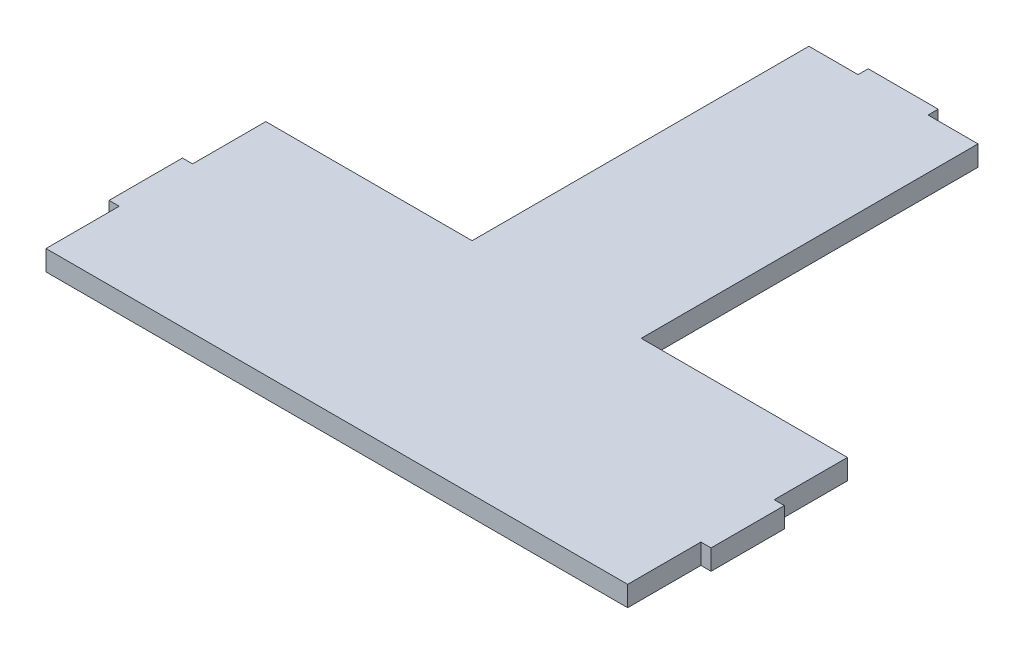
ISO-10303-21;
HEADER;
FILE_DESCRIPTION(('STEP AP214'),'2;1');
FILE_NAME('part.step','',(''),(''),'','','');
FILE_SCHEMA(('AUTOMOTIVE_DESIGN { 1 0 10303 214 1 1 1 1 }'));
ENDSEC;
DATA;
#1=APPLICATION_CONTEXT('core data for automotive mechanical design processes');
#2=APPLICATION_PROTOCOL_DEFINITION('international standard','automotive_design',2000,#1);
#3=PRODUCT_CONTEXT('',#1,'mechanical');
#4=PRODUCT('Part','Part','',(#3));
#5=PRODUCT_RELATED_PRODUCT_CATEGORY('part','',(#4));
#6=PRODUCT_DEFINITION_FORMATION('','',#4);
#7=PRODUCT_DEFINITION_CONTEXT('part definition',#1,'design');
#8=PRODUCT_DEFINITION('design','',#6,#7);
#9=PRODUCT_DEFINITION_SHAPE('','',#8);
#10=(LENGTH_UNIT() NAMED_UNIT(*) SI_UNIT(.MILLI.,.METRE.));
#11=(NAMED_UNIT(*) PLANE_ANGLE_UNIT() SI_UNIT($,.RADIAN.));
#12=(NAMED_UNIT(*) SI_UNIT($,.STERADIAN.) SOLID_ANGLE_UNIT());
#13=UNCERTAINTY_MEASURE_WITH_UNIT(LENGTH_MEASURE(1.E-05),#10,'distance_accuracy_value','');
#14=(GEOMETRIC_REPRESENTATION_CONTEXT(3) GLOBAL_UNCERTAINTY_ASSIGNED_CONTEXT((#13)) GLOBAL_UNIT_ASSIGNED_CONTEXT((#10,
#11,#12)) REPRESENTATION_CONTEXT('',''));
#15=CARTESIAN_POINT('',(0.,0.,0.));
#16=DIRECTION('',(0.,0.,1.));
#17=DIRECTION('',(1.,0.,0.));
#18=AXIS2_PLACEMENT_3D('',#15,#16,#17);
#19=CARTESIAN_POINT('',(14.5331080635397,6.,-50.9603818615753));
#20=DIRECTION('',(1.,0.,0.));
#21=DIRECTION('',(0.,0.,-1.));
#22=AXIS2_PLACEMENT_3D('',#19,#20,#21);
#23=PLANE('',#22);
#24=DIRECTION('',(0.,0.,1.));
#25=VECTOR('',#24,1.);
#26=CARTESIAN_POINT('',(14.5331080635397,0.,-50.9603818615753));
#27=LINE('',#26,#25);
#28=CARTESIAN_POINT('',(14.5331080635397,0.,-53.9603818615753));
#29=VERTEX_POINT('',#28);
#30=CARTESIAN_POINT('',(14.5331080635397,0.,-50.9603818615753));
#31=VERTEX_POINT('',#30);
#32=EDGE_CURVE('E201',#29,#31,#27,.T.);
#33=ORIENTED_EDGE('',*,*,#32,.T.);
#34=DIRECTION('',(0.,-1.,0.));
#35=VECTOR('',#34,1.);
#36=CARTESIAN_POINT('',(14.5331080635397,6.,-50.9603818615753));
#37=LINE('',#36,#35);
#38=CARTESIAN_POINT('',(14.5331080635397,6.,-50.9603818615753));
#39=VERTEX_POINT('',#38);
#40=EDGE_CURVE('E11',#39,#31,#37,.T.);
#41=ORIENTED_EDGE('',*,*,#40,.F.);
#42=DIRECTION('',(0.,0.,1.));
#43=VECTOR('',#42,1.);
#44=CARTESIAN_POINT('',(14.5331080635397,6.,-50.9603818615753));
#45=LINE('',#44,#43);
#46=CARTESIAN_POINT('',(14.5331080635397,6.,-53.9603818615753));
#47=VERTEX_POINT('',#46);
#48=EDGE_CURVE('E239',#47,#39,#45,.T.);
#49=ORIENTED_EDGE('',*,*,#48,.F.);
#50=DIRECTION('',(0.,-1.,0.));
#51=VECTOR('',#50,1.);
#52=CARTESIAN_POINT('',(14.5331080635397,6.,-53.9603818615753));
#53=LINE('',#52,#51);
#54=EDGE_CURVE('E197',#47,#29,#53,.T.);
#55=ORIENTED_EDGE('',*,*,#54,.T.);
#56=EDGE_LOOP('',(#33,#41,#49,#55));
#57=FACE_BOUND('',#56,.T.);
#58=ADVANCED_FACE('F33',(#57),#23,.F.);
#59=CARTESIAN_POINT('',(0.,6.,-50.9603818615753));
#60=DIRECTION('',(0.,0.,1.));
#61=DIRECTION('',(1.,0.,0.));
#62=AXIS2_PLACEMENT_3D('',#59,#60,#61);
#63=PLANE('',#62);
#64=DIRECTION('',(-1.,0.,0.));
#65=VECTOR('',#64,1.);
#66=CARTESIAN_POINT('',(0.,0.,-50.9603818615753));
#67=LINE('',#66,#65);
#68=CARTESIAN_POINT('',(0.,0.,-50.9603818615753));
#69=VERTEX_POINT('',#68);
#70=EDGE_CURVE('E204',#31,#69,#67,.T.);
#71=ORIENTED_EDGE('',*,*,#70,.T.);
#72=DIRECTION('',(0.,-1.,0.));
#73=VECTOR('',#72,1.);
#74=CARTESIAN_POINT('',(0.,6.,-50.9603818615753));
#75=LINE('',#74,#73);
#76=CARTESIAN_POINT('',(0.,6.,-50.9603818615753));
#77=VERTEX_POINT('',#76);
#78=EDGE_CURVE('E41',#77,#69,#75,.T.);
#79=ORIENTED_EDGE('',*,*,#78,.F.);
#80=DIRECTION('',(-1.,0.,0.));
#81=VECTOR('',#80,1.);
#82=CARTESIAN_POINT('',(0.,6.,-50.9603818615753));
#83=LINE('',#82,#81);
#84=EDGE_CURVE('E128',#39,#77,#83,.T.);
#85=ORIENTED_EDGE('',*,*,#84,.F.);
#86=ORIENTED_EDGE('',*,*,#40,.T.);
#87=EDGE_LOOP('',(#71,#79,#85,#86));
#88=FACE_BOUND('',#87,.T.);
#89=ADVANCED_FACE('F357',(#88),#63,.F.);
#90=CARTESIAN_POINT('',(0.,6.,-50.9603818615753));
#91=DIRECTION('',(1.,0.,0.));
#92=DIRECTION('',(0.,0.,-1.));
#93=AXIS2_PLACEMENT_3D('',#90,#91,#92);
#94=PLANE('',#93);
#95=DIRECTION('',(0.,0.,1.));
#96=VECTOR('',#95,1.);
#97=CARTESIAN_POINT('',(0.,0.,-50.9603818615753));
#98=LINE('',#97,#96);
#99=CARTESIAN_POINT('',(0.,0.,48.6396181384248));
#100=VERTEX_POINT('',#99);
#101=EDGE_CURVE('E206',#69,#100,#98,.T.);
#102=ORIENTED_EDGE('',*,*,#101,.T.);
#103=DIRECTION('',(0.,-1.,0.));
#104=VECTOR('',#103,1.);
#105=CARTESIAN_POINT('',(0.,6.,48.6396181384248));
#106=LINE('',#105,#104);
#107=CARTESIAN_POINT('',(0.,6.,48.6396181384248));
#108=VERTEX_POINT('',#107);
#109=EDGE_CURVE('E282',#108,#100,#106,.T.);
#110=ORIENTED_EDGE('',*,*,#109,.F.);
#111=DIRECTION('',(0.,0.,1.));
#112=VECTOR('',#111,1.);
#113=CARTESIAN_POINT('',(0.,6.,-50.9603818615753));
#114=LINE('',#113,#112);
#115=EDGE_CURVE('E290',#77,#108,#114,.T.);
#116=ORIENTED_EDGE('',*,*,#115,.F.);
#117=ORIENTED_EDGE('',*,*,#78,.T.);
#118=EDGE_LOOP('',(#102,#110,#116,#117));
#119=FACE_BOUND('',#118,.T.);
#120=ADVANCED_FACE('F288',(#119),#94,.F.);
#121=CARTESIAN_POINT('',(0.,6.,48.6396181384248));
#122=DIRECTION('',(0.,0.,1.));
#123=DIRECTION('',(1.,0.,0.));
#124=AXIS2_PLACEMENT_3D('',#121,#122,#123);
#125=PLANE('',#124);
#126=DIRECTION('',(-1.,0.,0.));
#127=VECTOR('',#126,1.);
#128=CARTESIAN_POINT('',(0.,0.,48.6396181384248));
#129=LINE('',#128,#127);
#130=CARTESIAN_POINT('',(-61.,0.,48.6396181384247));
#131=VERTEX_POINT('',#130);
#132=EDGE_CURVE('E208',#100,#131,#129,.T.);
#133=ORIENTED_EDGE('',*,*,#132,.T.);
#134=DIRECTION('',(0.,-1.,0.));
#135=VECTOR('',#134,1.);
#136=CARTESIAN_POINT('',(-61.,6.,48.6396181384247));
#137=LINE('',#136,#135);
#138=CARTESIAN_POINT('',(-61.,6.,48.6396181384247));
#139=VERTEX_POINT('',#138);
#140=EDGE_CURVE('E279',#139,#131,#137,.T.);
#141=ORIENTED_EDGE('',*,*,#140,.F.);
#142=DIRECTION('',(-1.,0.,0.));
#143=VECTOR('',#142,1.);
#144=CARTESIAN_POINT('',(0.,6.,48.6396181384248));
#145=LINE('',#144,#143);
#146=EDGE_CURVE('E308',#108,#139,#145,.T.);
#147=ORIENTED_EDGE('',*,*,#146,.F.);
#148=ORIENTED_EDGE('',*,*,#109,.T.);
#149=EDGE_LOOP('',(#133,#141,#147,#148));
#150=FACE_BOUND('',#149,.T.);
#151=ADVANCED_FACE('F299',(#150),#125,.F.);
#152=CARTESIAN_POINT('',(-61.,6.,48.6396181384247));
#153=DIRECTION('',(1.,0.,0.));
#154=DIRECTION('',(0.,0.,-1.));
#155=AXIS2_PLACEMENT_3D('',#152,#153,#154);
#156=PLANE('',#155);
#157=DIRECTION('',(0.,0.,1.));
#158=VECTOR('',#157,1.);
#159=CARTESIAN_POINT('',(-61.,0.,48.6396181384247));
#160=LINE('',#159,#158);
#161=CARTESIAN_POINT('',(-61.,0.,70.2996181384248));
#162=VERTEX_POINT('',#161);
#163=EDGE_CURVE('E210',#131,#162,#160,.T.);
#164=ORIENTED_EDGE('',*,*,#163,.T.);
#165=DIRECTION('',(0.,-1.,0.));
#166=VECTOR('',#165,1.);
#167=CARTESIAN_POINT('',(-61.,6.,70.2996181384248));
#168=LINE('',#167,#166);
#169=CARTESIAN_POINT('',(-61.,6.,70.2996181384248));
#170=VERTEX_POINT('',#169);
#171=EDGE_CURVE('E276',#170,#162,#168,.T.);
#172=ORIENTED_EDGE('',*,*,#171,.F.);
#173=DIRECTION('',(0.,0.,1.));
#174=VECTOR('',#173,1.);
#175=CARTESIAN_POINT('',(-61.,6.,48.6396181384247));
#176=LINE('',#175,#174);
#177=EDGE_CURVE('E305',#139,#170,#176,.T.);
#178=ORIENTED_EDGE('',*,*,#177,.F.);
#179=ORIENTED_EDGE('',*,*,#140,.T.);
#180=EDGE_LOOP('',(#164,#172,#178,#179));
#181=FACE_BOUND('',#180,.T.);
#182=ADVANCED_FACE('F303',(#181),#156,.F.);
#183=CARTESIAN_POINT('',(-61.,6.,70.2996181384248));
#184=DIRECTION('',(0.,0.,1.));
#185=DIRECTION('',(1.,0.,0.));
#186=AXIS2_PLACEMENT_3D('',#183,#184,#185);
#187=PLANE('',#186);
#188=DIRECTION('',(-1.,0.,0.));
#189=VECTOR('',#188,1.);
#190=CARTESIAN_POINT('',(-61.,0.,70.2996181384248));
#191=LINE('',#190,#189);
#192=CARTESIAN_POINT('',(-64.,0.,70.2996181384248));
#193=VERTEX_POINT('',#192);
#194=EDGE_CURVE('E212',#162,#193,#191,.T.);
#195=ORIENTED_EDGE('',*,*,#194,.T.);
#196=DIRECTION('',(0.,-1.,0.));
#197=VECTOR('',#196,1.);
#198=CARTESIAN_POINT('',(-64.,6.,70.2996181384248));
#199=LINE('',#198,#197);
#200=CARTESIAN_POINT('',(-64.,6.,70.2996181384248));
#201=VERTEX_POINT('',#200);
#202=EDGE_CURVE('E273',#201,#193,#199,.T.);
#203=ORIENTED_EDGE('',*,*,#202,.F.);
#204=DIRECTION('',(-1.,0.,0.));
#205=VECTOR('',#204,1.);
#206=CARTESIAN_POINT('',(-61.,6.,70.2996181384248));
#207=LINE('',#206,#205);
#208=EDGE_CURVE('E307',#170,#201,#207,.T.);
#209=ORIENTED_EDGE('',*,*,#208,.F.);
#210=ORIENTED_EDGE('',*,*,#171,.T.);
#211=EDGE_LOOP('',(#195,#203,#209,#210));
#212=FACE_BOUND('',#211,.T.);
#213=ADVANCED_FACE('F370',(#212),#187,.F.);
#214=CARTESIAN_POINT('',(-64.,6.,70.2996181384248));
#215=DIRECTION('',(1.,0.,0.));
#216=DIRECTION('',(0.,0.,-1.));
#217=AXIS2_PLACEMENT_3D('',#214,#215,#216);
#218=PLANE('',#217);
#219=DIRECTION('',(0.,0.,1.));
#220=VECTOR('',#219,1.);
#221=CARTESIAN_POINT('',(-64.,0.,70.2996181384248));
#222=LINE('',#221,#220);
#223=CARTESIAN_POINT('',(-64.,0.,91.9796181384248));
#224=VERTEX_POINT('',#223);
#225=EDGE_CURVE('E214',#193,#224,#222,.T.);
#226=ORIENTED_EDGE('',*,*,#225,.T.);
#227=DIRECTION('',(0.,-1.,0.));
#228=VECTOR('',#227,1.);
#229=CARTESIAN_POINT('',(-64.,6.,91.9796181384248));
#230=LINE('',#229,#228);
#231=CARTESIAN_POINT('',(-64.,6.,91.9796181384248));
#232=VERTEX_POINT('',#231);
#233=EDGE_CURVE('E270',#232,#224,#230,.T.);
#234=ORIENTED_EDGE('',*,*,#233,.F.);
#235=DIRECTION('',(0.,0.,1.));
#236=VECTOR('',#235,1.);
#237=CARTESIAN_POINT('',(-64.,6.,70.2996181384248));
#238=LINE('',#237,#236);
#239=EDGE_CURVE('E310',#201,#232,#238,.T.);
#240=ORIENTED_EDGE('',*,*,#239,.F.);
#241=ORIENTED_EDGE('',*,*,#202,.T.);
#242=EDGE_LOOP('',(#226,#234,#240,#241));
#243=FACE_BOUND('',#242,.T.);
#244=ADVANCED_FACE('F373',(#243),#218,.F.);
#245=CARTESIAN_POINT('',(-64.,6.,91.9796181384248));
#246=DIRECTION('',(0.,0.,-1.));
#247=DIRECTION('',(-1.,0.,0.));
#248=AXIS2_PLACEMENT_3D('',#245,#246,#247);
#249=PLANE('',#248);
#250=DIRECTION('',(1.,0.,0.));
#251=VECTOR('',#250,1.);
#252=CARTESIAN_POINT('',(-64.,0.,91.9796181384248));
#253=LINE('',#252,#251);
#254=CARTESIAN_POINT('',(-61.,0.,91.9796181384248));
#255=VERTEX_POINT('',#254);
#256=EDGE_CURVE('E216',#224,#255,#253,.T.);
#257=ORIENTED_EDGE('',*,*,#256,.T.);
#258=DIRECTION('',(0.,-1.,0.));
#259=VECTOR('',#258,1.);
#260=CARTESIAN_POINT('',(-61.,6.,91.9796181384248));
#261=LINE('',#260,#259);
#262=CARTESIAN_POINT('',(-61.,6.,91.9796181384248));
#263=VERTEX_POINT('',#262);
#264=EDGE_CURVE('E267',#263,#255,#261,.T.);
#265=ORIENTED_EDGE('',*,*,#264,.F.);
#266=DIRECTION('',(1.,0.,0.));
#267=VECTOR('',#266,1.);
#268=CARTESIAN_POINT('',(-64.,6.,91.9796181384248));
#269=LINE('',#268,#267);
#270=EDGE_CURVE('E316',#232,#263,#269,.T.);
#271=ORIENTED_EDGE('',*,*,#270,.F.);
#272=ORIENTED_EDGE('',*,*,#233,.T.);
#273=EDGE_LOOP('',(#257,#265,#271,#272));
#274=FACE_BOUND('',#273,.T.);
#275=ADVANCED_FACE('F377',(#274),#249,.F.);
#276=CARTESIAN_POINT('',(-61.,6.,91.9796181384248));
#277=DIRECTION('',(1.,0.,0.));
#278=DIRECTION('',(0.,0.,-1.));
#279=AXIS2_PLACEMENT_3D('',#276,#277,#278);
#280=PLANE('',#279);
#281=DIRECTION('',(0.,0.,1.));
#282=VECTOR('',#281,1.);
#283=CARTESIAN_POINT('',(-61.,0.,91.9796181384248));
#284=LINE('',#283,#282);
#285=CARTESIAN_POINT('',(-61.,0.,113.639618138425));
#286=VERTEX_POINT('',#285);
#287=EDGE_CURVE('E218',#255,#286,#284,.T.);
#288=ORIENTED_EDGE('',*,*,#287,.T.);
#289=DIRECTION('',(0.,-1.,0.));
#290=VECTOR('',#289,1.);
#291=CARTESIAN_POINT('',(-61.,6.,113.639618138425));
#292=LINE('',#291,#290);
#293=CARTESIAN_POINT('',(-61.,6.,113.639618138425));
#294=VERTEX_POINT('',#293);
#295=EDGE_CURVE('E264',#294,#286,#292,.T.);
#296=ORIENTED_EDGE('',*,*,#295,.F.);
#297=DIRECTION('',(0.,0.,1.));
#298=VECTOR('',#297,1.);
#299=CARTESIAN_POINT('',(-61.,6.,91.9796181384248));
#300=LINE('',#299,#298);
#301=EDGE_CURVE('E318',#263,#294,#300,.T.);
#302=ORIENTED_EDGE('',*,*,#301,.F.);
#303=ORIENTED_EDGE('',*,*,#264,.T.);
#304=EDGE_LOOP('',(#288,#296,#302,#303));
#305=FACE_BOUND('',#304,.T.);
#306=ADVANCED_FACE('F381',(#305),#280,.F.);
#307=CARTESIAN_POINT('',(-61.,6.,113.639618138425));
#308=DIRECTION('',(0.,0.,-1.));
#309=DIRECTION('',(-1.,0.,0.));
#310=AXIS2_PLACEMENT_3D('',#307,#308,#309);
#311=PLANE('',#310);
#312=DIRECTION('',(1.,0.,0.));
#313=VECTOR('',#312,1.);
#314=CARTESIAN_POINT('',(-61.,0.,113.639618138425));
#315=LINE('',#314,#313);
#316=CARTESIAN_POINT('',(111.,0.,113.639618138425));
#317=VERTEX_POINT('',#316);
#318=EDGE_CURVE('E220',#286,#317,#315,.T.);
#319=ORIENTED_EDGE('',*,*,#318,.T.);
#320=DIRECTION('',(0.,-1.,0.));
#321=VECTOR('',#320,1.);
#322=CARTESIAN_POINT('',(111.,6.,113.639618138425));
#323=LINE('',#322,#321);
#324=CARTESIAN_POINT('',(111.,6.,113.639618138425));
#325=VERTEX_POINT('',#324);
#326=EDGE_CURVE('E261',#325,#317,#323,.T.);
#327=ORIENTED_EDGE('',*,*,#326,.F.);
#328=DIRECTION('',(1.,0.,0.));
#329=VECTOR('',#328,1.);
#330=CARTESIAN_POINT('',(-61.,6.,113.639618138425));
#331=LINE('',#330,#329);
#332=EDGE_CURVE('E320',#294,#325,#331,.T.);
#333=ORIENTED_EDGE('',*,*,#332,.F.);
#334=ORIENTED_EDGE('',*,*,#295,.T.);
#335=EDGE_LOOP('',(#319,#327,#333,#334));
#336=FACE_BOUND('',#335,.T.);
#337=ADVANCED_FACE('F385',(#336),#311,.F.);
#338=CARTESIAN_POINT('',(111.,6.,113.639618138425));
#339=DIRECTION('',(-1.,0.,0.));
#340=DIRECTION('',(0.,0.,1.));
#341=AXIS2_PLACEMENT_3D('',#338,#339,#340);
#342=PLANE('',#341);
#343=DIRECTION('',(0.,0.,-1.));
#344=VECTOR('',#343,1.);
#345=CARTESIAN_POINT('',(111.,0.,113.639618138425));
#346=LINE('',#345,#344);
#347=CARTESIAN_POINT('',(111.,0.,91.9796181384248));
#348=VERTEX_POINT('',#347);
#349=EDGE_CURVE('E222',#317,#348,#346,.T.);
#350=ORIENTED_EDGE('',*,*,#349,.T.);
#351=DIRECTION('',(0.,-1.,0.));
#352=VECTOR('',#351,1.);
#353=CARTESIAN_POINT('',(111.,6.,91.9796181384248));
#354=LINE('',#353,#352);
#355=CARTESIAN_POINT('',(111.,6.,91.9796181384248));
#356=VERTEX_POINT('',#355);
#357=EDGE_CURVE('E258',#356,#348,#354,.T.);
#358=ORIENTED_EDGE('',*,*,#357,.F.);
#359=DIRECTION('',(0.,0.,-1.));
#360=VECTOR('',#359,1.);
#361=CARTESIAN_POINT('',(111.,6.,113.639618138425));
#362=LINE('',#361,#360);
#363=EDGE_CURVE('E322',#325,#356,#362,.T.);
#364=ORIENTED_EDGE('',*,*,#363,.F.);
#365=ORIENTED_EDGE('',*,*,#326,.T.);
#366=EDGE_LOOP('',(#350,#358,#364,#365));
#367=FACE_BOUND('',#366,.T.);
#368=ADVANCED_FACE('F389',(#367),#342,.F.);
#369=CARTESIAN_POINT('',(111.,6.,91.9796181384248));
#370=DIRECTION('',(0.,0.,-1.));
#371=DIRECTION('',(-1.,0.,0.));
#372=AXIS2_PLACEMENT_3D('',#369,#370,#371);
#373=PLANE('',#372);
#374=DIRECTION('',(1.,0.,0.));
#375=VECTOR('',#374,1.);
#376=CARTESIAN_POINT('',(111.,0.,91.9796181384248));
#377=LINE('',#376,#375);
#378=CARTESIAN_POINT('',(114.,0.,91.9796181384248));
#379=VERTEX_POINT('',#378);
#380=EDGE_CURVE('E224',#348,#379,#377,.T.);
#381=ORIENTED_EDGE('',*,*,#380,.T.);
#382=DIRECTION('',(0.,-1.,0.));
#383=VECTOR('',#382,1.);
#384=CARTESIAN_POINT('',(114.,6.,91.9796181384248));
#385=LINE('',#384,#383);
#386=CARTESIAN_POINT('',(114.,6.,91.9796181384248));
#387=VERTEX_POINT('',#386);
#388=EDGE_CURVE('E255',#387,#379,#385,.T.);
#389=ORIENTED_EDGE('',*,*,#388,.F.);
#390=DIRECTION('',(1.,0.,0.));
#391=VECTOR('',#390,1.);
#392=CARTESIAN_POINT('',(111.,6.,91.9796181384248));
#393=LINE('',#392,#391);
#394=EDGE_CURVE('E324',#356,#387,#393,.T.);
#395=ORIENTED_EDGE('',*,*,#394,.F.);
#396=ORIENTED_EDGE('',*,*,#357,.T.);
#397=EDGE_LOOP('',(#381,#389,#395,#396));
#398=FACE_BOUND('',#397,.T.);
#399=ADVANCED_FACE('F393',(#398),#373,.F.);
#400=CARTESIAN_POINT('',(114.,6.,70.2996181384248));
#401=DIRECTION('',(-1.,0.,0.));
#402=DIRECTION('',(0.,0.,1.));
#403=AXIS2_PLACEMENT_3D('',#400,#401,#402);
#404=PLANE('',#403);
#405=DIRECTION('',(0.,0.,-1.));
#406=VECTOR('',#405,1.);
#407=CARTESIAN_POINT('',(114.,0.,70.2996181384248));
#408=LINE('',#407,#406);
#409=CARTESIAN_POINT('',(114.,0.,70.2996181384248));
#410=VERTEX_POINT('',#409);
#411=EDGE_CURVE('E226',#379,#410,#408,.T.);
#412=ORIENTED_EDGE('',*,*,#411,.T.);
#413=DIRECTION('',(0.,-1.,0.));
#414=VECTOR('',#413,1.);
#415=CARTESIAN_POINT('',(114.,6.,70.2996181384248));
#416=LINE('',#415,#414);
#417=CARTESIAN_POINT('',(114.,6.,70.2996181384248));
#418=VERTEX_POINT('',#417);
#419=EDGE_CURVE('E252',#418,#410,#416,.T.);
#420=ORIENTED_EDGE('',*,*,#419,.F.);
#421=DIRECTION('',(0.,0.,-1.));
#422=VECTOR('',#421,1.);
#423=CARTESIAN_POINT('',(114.,6.,70.2996181384248));
#424=LINE('',#423,#422);
#425=EDGE_CURVE('E326',#387,#418,#424,.T.);
#426=ORIENTED_EDGE('',*,*,#425,.F.);
#427=ORIENTED_EDGE('',*,*,#388,.T.);
#428=EDGE_LOOP('',(#412,#420,#426,#427));
#429=FACE_BOUND('',#428,.T.);
#430=ADVANCED_FACE('F397',(#429),#404,.F.);
#431=CARTESIAN_POINT('',(111.,6.,70.2996181384248));
#432=DIRECTION('',(0.,0.,1.));
#433=DIRECTION('',(1.,0.,0.));
#434=AXIS2_PLACEMENT_3D('',#431,#432,#433);
#435=PLANE('',#434);
#436=DIRECTION('',(-1.,0.,0.));
#437=VECTOR('',#436,1.);
#438=CARTESIAN_POINT('',(111.,0.,70.2996181384248));
#439=LINE('',#438,#437);
#440=CARTESIAN_POINT('',(111.,0.,70.2996181384248));
#441=VERTEX_POINT('',#440);
#442=EDGE_CURVE('E228',#410,#441,#439,.T.);
#443=ORIENTED_EDGE('',*,*,#442,.T.);
#444=DIRECTION('',(0.,-1.,0.));
#445=VECTOR('',#444,1.);
#446=CARTESIAN_POINT('',(111.,6.,70.2996181384248));
#447=LINE('',#446,#445);
#448=CARTESIAN_POINT('',(111.,6.,70.2996181384248));
#449=VERTEX_POINT('',#448);
#450=EDGE_CURVE('E249',#449,#441,#447,.T.);
#451=ORIENTED_EDGE('',*,*,#450,.F.);
#452=DIRECTION('',(-1.,0.,0.));
#453=VECTOR('',#452,1.);
#454=CARTESIAN_POINT('',(111.,6.,70.2996181384248));
#455=LINE('',#454,#453);
#456=EDGE_CURVE('E328',#418,#449,#455,.T.);
#457=ORIENTED_EDGE('',*,*,#456,.F.);
#458=ORIENTED_EDGE('',*,*,#419,.T.);
#459=EDGE_LOOP('',(#443,#451,#457,#458));
#460=FACE_BOUND('',#459,.T.);
#461=ADVANCED_FACE('F401',(#460),#435,.F.);
#462=CARTESIAN_POINT('',(111.,6.,70.2996181384248));
#463=DIRECTION('',(-1.,0.,0.));
#464=DIRECTION('',(0.,0.,1.));
#465=AXIS2_PLACEMENT_3D('',#462,#463,#464);
#466=PLANE('',#465);
#467=DIRECTION('',(0.,0.,-1.));
#468=VECTOR('',#467,1.);
#469=CARTESIAN_POINT('',(111.,0.,70.2996181384248));
#470=LINE('',#469,#468);
#471=CARTESIAN_POINT('',(111.,0.,48.6396181384247));
#472=VERTEX_POINT('',#471);
#473=EDGE_CURVE('E230',#441,#472,#470,.T.);
#474=ORIENTED_EDGE('',*,*,#473,.T.);
#475=DIRECTION('',(0.,-1.,0.));
#476=VECTOR('',#475,1.);
#477=CARTESIAN_POINT('',(111.,6.,48.6396181384247));
#478=LINE('',#477,#476);
#479=CARTESIAN_POINT('',(111.,6.,48.6396181384247));
#480=VERTEX_POINT('',#479);
#481=EDGE_CURVE('E246',#480,#472,#478,.T.);
#482=ORIENTED_EDGE('',*,*,#481,.F.);
#483=DIRECTION('',(0.,0.,-1.));
#484=VECTOR('',#483,1.);
#485=CARTESIAN_POINT('',(111.,6.,70.2996181384248));
#486=LINE('',#485,#484);
#487=EDGE_CURVE('E330',#449,#480,#486,.T.);
#488=ORIENTED_EDGE('',*,*,#487,.F.);
#489=ORIENTED_EDGE('',*,*,#450,.T.);
#490=EDGE_LOOP('',(#474,#482,#488,#489));
#491=FACE_BOUND('',#490,.T.);
#492=ADVANCED_FACE('F405',(#491),#466,.F.);
#493=CARTESIAN_POINT('',(111.,6.,48.6396181384247));
#494=DIRECTION('',(0.,0.,1.));
#495=DIRECTION('',(1.,0.,0.));
#496=AXIS2_PLACEMENT_3D('',#493,#494,#495);
#497=PLANE('',#496);
#498=DIRECTION('',(-1.,0.,0.));
#499=VECTOR('',#498,1.);
#500=CARTESIAN_POINT('',(111.,0.,48.6396181384247));
#501=LINE('',#500,#499);
#502=CARTESIAN_POINT('',(50.,0.,48.6396181384247));
#503=VERTEX_POINT('',#502);
#504=EDGE_CURVE('E232',#472,#503,#501,.T.);
#505=ORIENTED_EDGE('',*,*,#504,.T.);
#506=DIRECTION('',(0.,-1.,0.));
#507=VECTOR('',#506,1.);
#508=CARTESIAN_POINT('',(50.,6.,48.6396181384247));
#509=LINE('',#508,#507);
#510=CARTESIAN_POINT('',(50.,6.,48.6396181384247));
#511=VERTEX_POINT('',#510);
#512=EDGE_CURVE('E243',#511,#503,#509,.T.);
#513=ORIENTED_EDGE('',*,*,#512,.F.);
#514=DIRECTION('',(-1.,0.,0.));
#515=VECTOR('',#514,1.);
#516=CARTESIAN_POINT('',(111.,6.,48.6396181384247));
#517=LINE('',#516,#515);
#518=EDGE_CURVE('E332',#480,#511,#517,.T.);
#519=ORIENTED_EDGE('',*,*,#518,.F.);
#520=ORIENTED_EDGE('',*,*,#481,.T.);
#521=EDGE_LOOP('',(#505,#513,#519,#520));
#522=FACE_BOUND('',#521,.T.);
#523=ADVANCED_FACE('F338',(#522),#497,.F.);
#524=CARTESIAN_POINT('',(50.,6.,48.6396181384247));
#525=DIRECTION('',(-1.,0.,0.));
#526=DIRECTION('',(0.,0.,1.));
#527=AXIS2_PLACEMENT_3D('',#524,#525,#526);
#528=PLANE('',#527);
#529=DIRECTION('',(0.,0.,-1.));
#530=VECTOR('',#529,1.);
#531=CARTESIAN_POINT('',(50.,0.,48.6396181384247));
#532=LINE('',#531,#530);
#533=CARTESIAN_POINT('',(50.,0.,-50.9603818615753));
#534=VERTEX_POINT('',#533);
#535=EDGE_CURVE('E234',#503,#534,#532,.T.);
#536=ORIENTED_EDGE('',*,*,#535,.T.);
#537=DIRECTION('',(0.,-1.,0.));
#538=VECTOR('',#537,1.);
#539=CARTESIAN_POINT('',(50.,6.,-50.9603818615753));
#540=LINE('',#539,#538);
#541=CARTESIAN_POINT('',(50.,6.,-50.9603818615753));
#542=VERTEX_POINT('',#541);
#543=EDGE_CURVE('E192',#542,#534,#540,.T.);
#544=ORIENTED_EDGE('',*,*,#543,.F.);
#545=DIRECTION('',(0.,0.,-1.));
#546=VECTOR('',#545,1.);
#547=CARTESIAN_POINT('',(50.,6.,48.6396181384247));
#548=LINE('',#547,#546);
#549=EDGE_CURVE('E183',#511,#542,#548,.T.);
#550=ORIENTED_EDGE('',*,*,#549,.F.);
#551=ORIENTED_EDGE('',*,*,#512,.T.);
#552=EDGE_LOOP('',(#536,#544,#550,#551));
#553=FACE_BOUND('',#552,.T.);
#554=ADVANCED_FACE('F342',(#553),#528,.F.);
#555=CARTESIAN_POINT('',(35.2290789317978,6.,-50.9603818615753));
#556=DIRECTION('',(0.,0.,1.));
#557=DIRECTION('',(1.,0.,0.));
#558=AXIS2_PLACEMENT_3D('',#555,#556,#557);
#559=PLANE('',#558);
#560=DIRECTION('',(-1.,0.,0.));
#561=VECTOR('',#560,1.);
#562=CARTESIAN_POINT('',(35.2290789317978,0.,-50.9603818615753));
#563=LINE('',#562,#561);
#564=CARTESIAN_POINT('',(35.2290789317978,0.,-50.9603818615753));
#565=VERTEX_POINT('',#564);
#566=EDGE_CURVE('E191',#534,#565,#563,.T.);
#567=ORIENTED_EDGE('',*,*,#566,.T.);
#568=DIRECTION('',(0.,-1.,0.));
#569=VECTOR('',#568,1.);
#570=CARTESIAN_POINT('',(35.2290789317978,6.,-50.9603818615753));
#571=LINE('',#570,#569);
#572=CARTESIAN_POINT('',(35.2290789317978,6.,-50.9603818615753));
#573=VERTEX_POINT('',#572);
#574=EDGE_CURVE('E188',#573,#565,#571,.T.);
#575=ORIENTED_EDGE('',*,*,#574,.F.);
#576=DIRECTION('',(-1.,0.,0.));
#577=VECTOR('',#576,1.);
#578=CARTESIAN_POINT('',(35.2290789317978,6.,-50.9603818615753));
#579=LINE('',#578,#577);
#580=EDGE_CURVE('E177',#542,#573,#579,.T.);
#581=ORIENTED_EDGE('',*,*,#580,.F.);
#582=ORIENTED_EDGE('',*,*,#543,.T.);
#583=EDGE_LOOP('',(#567,#575,#581,#582));
#584=FACE_BOUND('',#583,.T.);
#585=ADVANCED_FACE('F189',(#584),#559,.F.);
#586=CARTESIAN_POINT('',(35.2290789317978,6.,-53.9603818615753));
#587=DIRECTION('',(-1.,0.,0.));
#588=DIRECTION('',(0.,0.,1.));
#589=AXIS2_PLACEMENT_3D('',#586,#587,#588);
#590=PLANE('',#589);
#591=DIRECTION('',(0.,0.,-1.));
#592=VECTOR('',#591,1.);
#593=CARTESIAN_POINT('',(35.2290789317978,0.,-53.9603818615753));
#594=LINE('',#593,#592);
#595=CARTESIAN_POINT('',(35.2290789317978,0.,-53.9603818615753));
#596=VERTEX_POINT('',#595);
#597=EDGE_CURVE('E114',#565,#596,#594,.T.);
#598=ORIENTED_EDGE('',*,*,#597,.T.);
#599=DIRECTION('',(0.,-1.,0.));
#600=VECTOR('',#599,1.);
#601=CARTESIAN_POINT('',(35.2290789317978,6.,-53.9603818615753));
#602=LINE('',#601,#600);
#603=CARTESIAN_POINT('',(35.2290789317978,6.,-53.9603818615753));
#604=VERTEX_POINT('',#603);
#605=EDGE_CURVE('E193',#604,#596,#602,.T.);
#606=ORIENTED_EDGE('',*,*,#605,.F.);
#607=DIRECTION('',(0.,0.,-1.));
#608=VECTOR('',#607,1.);
#609=CARTESIAN_POINT('',(35.2290789317978,6.,-53.9603818615753));
#610=LINE('',#609,#608);
#611=EDGE_CURVE('E181',#573,#604,#610,.T.);
#612=ORIENTED_EDGE('',*,*,#611,.F.);
#613=ORIENTED_EDGE('',*,*,#574,.T.);
#614=EDGE_LOOP('',(#598,#606,#612,#613));
#615=FACE_BOUND('',#614,.T.);
#616=ADVANCED_FACE('F195',(#615),#590,.F.);
#617=CARTESIAN_POINT('',(14.5331080635397,6.,-53.9603818615753));
#618=DIRECTION('',(0.,0.,1.));
#619=DIRECTION('',(1.,0.,0.));
#620=AXIS2_PLACEMENT_3D('',#617,#618,#619);
#621=PLANE('',#620);
#622=DIRECTION('',(-1.,0.,0.));
#623=VECTOR('',#622,1.);
#624=CARTESIAN_POINT('',(14.5331080635397,0.,-53.9603818615753));
#625=LINE('',#624,#623);
#626=EDGE_CURVE('E120',#596,#29,#625,.T.);
#627=ORIENTED_EDGE('',*,*,#626,.T.);
#628=ORIENTED_EDGE('',*,*,#54,.F.);
#629=DIRECTION('',(-1.,0.,0.));
#630=VECTOR('',#629,1.);
#631=CARTESIAN_POINT('',(14.5331080635397,6.,-53.9603818615753));
#632=LINE('',#631,#630);
#633=EDGE_CURVE('E49',#604,#47,#632,.T.);
#634=ORIENTED_EDGE('',*,*,#633,.F.);
#635=ORIENTED_EDGE('',*,*,#605,.T.);
#636=EDGE_LOOP('',(#627,#628,#634,#635));
#637=FACE_BOUND('',#636,.T.);
#638=ADVANCED_FACE('F346',(#637),#621,.F.);
#639=CARTESIAN_POINT('',(0.,6.,0.));
#640=DIRECTION('',(0.,-1.,0.));
#641=DIRECTION('',(0.,0.,-1.));
#642=AXIS2_PLACEMENT_3D('',#639,#640,#641);
#643=PLANE('',#642);
#644=ORIENTED_EDGE('',*,*,#48,.T.);
#645=ORIENTED_EDGE('',*,*,#84,.T.);
#646=ORIENTED_EDGE('',*,*,#115,.T.);
#647=ORIENTED_EDGE('',*,*,#146,.T.);
#648=ORIENTED_EDGE('',*,*,#177,.T.);
#649=ORIENTED_EDGE('',*,*,#208,.T.);
#650=ORIENTED_EDGE('',*,*,#239,.T.);
#651=ORIENTED_EDGE('',*,*,#270,.T.);
#652=ORIENTED_EDGE('',*,*,#301,.T.);
#653=ORIENTED_EDGE('',*,*,#332,.T.);
#654=ORIENTED_EDGE('',*,*,#363,.T.);
#655=ORIENTED_EDGE('',*,*,#394,.T.);
#656=ORIENTED_EDGE('',*,*,#425,.T.);
#657=ORIENTED_EDGE('',*,*,#456,.T.);
#658=ORIENTED_EDGE('',*,*,#487,.T.);
#659=ORIENTED_EDGE('',*,*,#518,.T.);
#660=ORIENTED_EDGE('',*,*,#549,.T.);
#661=ORIENTED_EDGE('',*,*,#580,.T.);
#662=ORIENTED_EDGE('',*,*,#611,.T.);
#663=ORIENTED_EDGE('',*,*,#633,.T.);
#664=EDGE_LOOP('',(#644,#645,#646,#647,#648,#649,#650,#651,#652,#653,#654,#655,#656,#657,#658,
#659,#660,#661,#662,#663));
#665=FACE_BOUND('',#664,.T.);
#666=ADVANCED_FACE('F179',(#665),#643,.F.);
#667=CARTESIAN_POINT('',(0.,0.,0.));
#668=DIRECTION('',(0.,-1.,0.));
#669=DIRECTION('',(0.,0.,-1.));
#670=AXIS2_PLACEMENT_3D('',#667,#668,#669);
#671=PLANE('',#670);
#672=ORIENTED_EDGE('',*,*,#32,.F.);
#673=ORIENTED_EDGE('',*,*,#626,.F.);
#674=ORIENTED_EDGE('',*,*,#597,.F.);
#675=ORIENTED_EDGE('',*,*,#566,.F.);
#676=ORIENTED_EDGE('',*,*,#535,.F.);
#677=ORIENTED_EDGE('',*,*,#504,.F.);
#678=ORIENTED_EDGE('',*,*,#473,.F.);
#679=ORIENTED_EDGE('',*,*,#442,.F.);
#680=ORIENTED_EDGE('',*,*,#411,.F.);
#681=ORIENTED_EDGE('',*,*,#380,.F.);
#682=ORIENTED_EDGE('',*,*,#349,.F.);
#683=ORIENTED_EDGE('',*,*,#318,.F.);
#684=ORIENTED_EDGE('',*,*,#287,.F.);
#685=ORIENTED_EDGE('',*,*,#256,.F.);
#686=ORIENTED_EDGE('',*,*,#225,.F.);
#687=ORIENTED_EDGE('',*,*,#194,.F.);
#688=ORIENTED_EDGE('',*,*,#163,.F.);
#689=ORIENTED_EDGE('',*,*,#132,.F.);
#690=ORIENTED_EDGE('',*,*,#101,.F.);
#691=ORIENTED_EDGE('',*,*,#70,.F.);
#692=EDGE_LOOP('',(#672,#673,#674,#675,#676,#677,#678,#679,#680,#681,#682,#683,#684,#685,#686,
#687,#688,#689,#690,#691));
#693=FACE_BOUND('',#692,.T.);
#694=ADVANCED_FACE('F294',(#693),#671,.T.);
#695=CLOSED_SHELL('',(#58,#89,#120,#151,#182,#213,#244,#275,#306,#337,#368,#399,#430,#461,#492,
#523,#554,#585,#616,#638,#666,#694));
#696=MANIFOLD_SOLID_BREP('B2',#695);
#697=ADVANCED_BREP_SHAPE_REPRESENTATION('',(#18,#696),#14);
#698=SHAPE_DEFINITION_REPRESENTATION(#9,#697);
ENDSEC;
END-ISO-10303-21;
